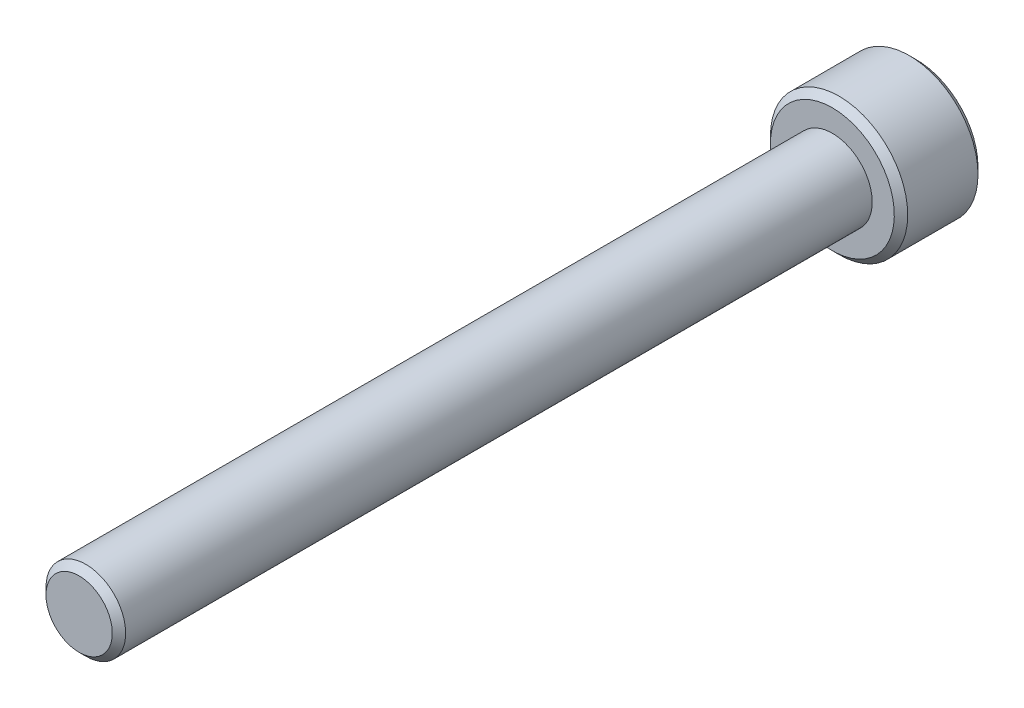
ISO-10303-21;
HEADER;
FILE_DESCRIPTION(('STEP AP214'),'2;1');
FILE_NAME('part.step','',(''),(''),'','','');
FILE_SCHEMA(('AUTOMOTIVE_DESIGN { 1 0 10303 214 1 1 1 1 }'));
ENDSEC;
DATA;
#1=APPLICATION_CONTEXT('core data for automotive mechanical design processes');
#2=APPLICATION_PROTOCOL_DEFINITION('international standard','automotive_design',2000,#1);
#3=PRODUCT_CONTEXT('',#1,'mechanical');
#4=PRODUCT('Part','Part','',(#3));
#5=PRODUCT_RELATED_PRODUCT_CATEGORY('part','',(#4));
#6=PRODUCT_DEFINITION_FORMATION('','',#4);
#7=PRODUCT_DEFINITION_CONTEXT('part definition',#1,'design');
#8=PRODUCT_DEFINITION('design','',#6,#7);
#9=PRODUCT_DEFINITION_SHAPE('','',#8);
#10=(LENGTH_UNIT() NAMED_UNIT(*) SI_UNIT(.MILLI.,.METRE.));
#11=(NAMED_UNIT(*) PLANE_ANGLE_UNIT() SI_UNIT($,.RADIAN.));
#12=(NAMED_UNIT(*) SI_UNIT($,.STERADIAN.) SOLID_ANGLE_UNIT());
#13=UNCERTAINTY_MEASURE_WITH_UNIT(LENGTH_MEASURE(1.E-05),#10,'distance_accuracy_value','');
#14=(GEOMETRIC_REPRESENTATION_CONTEXT(3) GLOBAL_UNCERTAINTY_ASSIGNED_CONTEXT((#13)) GLOBAL_UNIT_ASSIGNED_CONTEXT((#10,
#11,#12)) REPRESENTATION_CONTEXT('',''));
#15=CARTESIAN_POINT('',(0.,0.,0.));
#16=DIRECTION('',(0.,0.,1.));
#17=DIRECTION('',(1.,0.,0.));
#18=AXIS2_PLACEMENT_3D('',#15,#16,#17);
#19=CARTESIAN_POINT('',(-0.674576054522258,1.16839999999997,-29.2099999999992));
#20=DIRECTION('',(0.,1.,0.));
#21=DIRECTION('',(-1.,0.,0.));
#22=AXIS2_PLACEMENT_3D('',#19,#20,#21);
#23=PLANE('',#22);
#24=DIRECTION('',(0.,0.,1.));
#25=VECTOR('',#24,1.);
#26=CARTESIAN_POINT('',(0.674576054521041,1.16840000000002,-29.2100000000007));
#27=LINE('',#26,#25);
#28=CARTESIAN_POINT('',(0.674576054520974,1.16839999999998,-31.7500000000003));
#29=VERTEX_POINT('',#28);
#30=CARTESIAN_POINT('',(0.674576054521038,1.1684,-29.2099999999996));
#31=VERTEX_POINT('',#30);
#32=EDGE_CURVE('E82',#29,#31,#27,.T.);
#33=ORIENTED_EDGE('',*,*,#32,.T.);
#34=DIRECTION('',(-1.,0.,0.));
#35=VECTOR('',#34,1.);
#36=CARTESIAN_POINT('',(-0.674576054522258,1.16839999999997,-29.2099999999992));
#37=LINE('',#36,#35);
#38=CARTESIAN_POINT('',(-0.674576054522049,1.1684,-29.2099999999992));
#39=VERTEX_POINT('',#38);
#40=EDGE_CURVE('E71',#39,#31,#37,.F.);
#41=ORIENTED_EDGE('',*,*,#40,.F.);
#42=DIRECTION('',(0.,0.,1.));
#43=VECTOR('',#42,1.);
#44=CARTESIAN_POINT('',(-0.674576054522344,1.16840000000002,-29.2099999999992));
#45=LINE('',#44,#43);
#46=CARTESIAN_POINT('',(-0.674576054521946,1.16839999999998,-31.7500000000003));
#47=VERTEX_POINT('',#46);
#48=EDGE_CURVE('E90',#39,#47,#45,.F.);
#49=ORIENTED_EDGE('',*,*,#48,.T.);
#50=DIRECTION('',(-1.,0.,0.));
#51=VECTOR('',#50,1.);
#52=CARTESIAN_POINT('',(-0.674576054522258,1.16839999999997,-31.7500000000007));
#53=LINE('',#52,#51);
#54=EDGE_CURVE('E66',#29,#47,#53,.T.);
#55=ORIENTED_EDGE('',*,*,#54,.F.);
#56=EDGE_LOOP('',(#33,#41,#49,#55));
#57=FACE_BOUND('',#56,.T.);
#58=ADVANCED_FACE('F16',(#57),#23,.F.);
#59=CARTESIAN_POINT('',(0.674576054521037,1.16840000000003,-29.2100000000007));
#60=DIRECTION('',(0.866025403784436,0.500000000000005,0.));
#61=DIRECTION('',(-0.500000000000005,0.866025403784436,0.));
#62=AXIS2_PLACEMENT_3D('',#59,#60,#61);
#63=PLANE('',#62);
#64=DIRECTION('',(0.,0.,1.));
#65=VECTOR('',#64,1.);
#66=CARTESIAN_POINT('',(1.34915210904188,0.,-29.2099999999992));
#67=LINE('',#66,#65);
#68=CARTESIAN_POINT('',(1.34915210904193,0.,-31.7499999999996));
#69=VERTEX_POINT('',#68);
#70=CARTESIAN_POINT('',(1.34915210904201,0.,-29.21));
#71=VERTEX_POINT('',#70);
#72=EDGE_CURVE('E86',#69,#71,#67,.T.);
#73=ORIENTED_EDGE('',*,*,#72,.T.);
#74=DIRECTION('',(-0.500000000000005,0.866025403784436,0.));
#75=VECTOR('',#74,1.);
#76=CARTESIAN_POINT('',(0.674576054521037,1.16840000000003,-29.2100000000007));
#77=LINE('',#76,#75);
#78=EDGE_CURVE('E75',#31,#71,#77,.F.);
#79=ORIENTED_EDGE('',*,*,#78,.F.);
#80=ORIENTED_EDGE('',*,*,#32,.F.);
#81=DIRECTION('',(-0.500000000000005,0.866025403784436,0.));
#82=VECTOR('',#81,1.);
#83=CARTESIAN_POINT('',(0.674576054521037,1.16840000000003,-31.7499999999992));
#84=LINE('',#83,#82);
#85=EDGE_CURVE('E88',#69,#29,#84,.T.);
#86=ORIENTED_EDGE('',*,*,#85,.F.);
#87=EDGE_LOOP('',(#73,#79,#80,#86));
#88=FACE_BOUND('',#87,.T.);
#89=ADVANCED_FACE('F85',(#88),#63,.F.);
#90=CARTESIAN_POINT('',(-1.34915210904363,-2.08166817117217E-13,-29.2099999999992));
#91=DIRECTION('',(-0.866025403784441,0.499999999999995,0.));
#92=DIRECTION('',(-0.499999999999995,-0.866025403784441,0.));
#93=AXIS2_PLACEMENT_3D('',#90,#91,#92);
#94=PLANE('',#93);
#95=ORIENTED_EDGE('',*,*,#48,.F.);
#96=DIRECTION('',(-0.500000000000059,-0.866025403784404,0.));
#97=VECTOR('',#96,1.);
#98=CARTESIAN_POINT('',(-0.674576054522258,1.16839999999997,-29.2099999999992));
#99=LINE('',#98,#97);
#100=CARTESIAN_POINT('',(-1.34915210904357,-1.3521187083714E-13,-29.2099999999992));
#101=VERTEX_POINT('',#100);
#102=EDGE_CURVE('E78',#39,#101,#99,.T.);
#103=ORIENTED_EDGE('',*,*,#102,.T.);
#104=DIRECTION('',(0.,0.,1.));
#105=VECTOR('',#104,1.);
#106=CARTESIAN_POINT('',(-1.34915210904355,-1.65015570652294E-13,-29.2099999999992));
#107=LINE('',#106,#105);
#108=CARTESIAN_POINT('',(-1.34915210904345,0.,-31.7499999999996));
#109=VERTEX_POINT('',#108);
#110=EDGE_CURVE('E124',#101,#109,#107,.F.);
#111=ORIENTED_EDGE('',*,*,#110,.T.);
#112=DIRECTION('',(-0.499999999999995,-0.866025403784441,0.));
#113=VECTOR('',#112,1.);
#114=CARTESIAN_POINT('',(-1.34915210904363,-2.08166817117163E-13,-31.7499999999991));
#115=LINE('',#114,#113);
#116=EDGE_CURVE('E134',#47,#109,#115,.T.);
#117=ORIENTED_EDGE('',*,*,#116,.F.);
#118=EDGE_LOOP('',(#95,#103,#111,#117));
#119=FACE_BOUND('',#118,.T.);
#120=ADVANCED_FACE('F137',(#119),#94,.F.);
#121=CARTESIAN_POINT('',(1.34915210904185,0.,-29.2099999999992));
#122=DIRECTION('',(0.866025403784441,-0.499999999999996,0.));
#123=DIRECTION('',(0.499999999999996,0.866025403784441,0.));
#124=AXIS2_PLACEMENT_3D('',#121,#122,#123);
#125=PLANE('',#124);
#126=DIRECTION('',(0.,0.,1.));
#127=VECTOR('',#126,1.);
#128=CARTESIAN_POINT('',(0.674576054520259,-1.16840000000031,-29.2099999999992));
#129=LINE('',#128,#127);
#130=CARTESIAN_POINT('',(0.674576054520401,-1.1684000000004,-31.7499999999996));
#131=VERTEX_POINT('',#130);
#132=CARTESIAN_POINT('',(0.674576054520473,-1.1684000000003,-29.2099999999992));
#133=VERTEX_POINT('',#132);
#134=EDGE_CURVE('E120',#131,#133,#129,.T.);
#135=ORIENTED_EDGE('',*,*,#134,.T.);
#136=DIRECTION('',(0.500000000000042,0.866025403784415,0.));
#137=VECTOR('',#136,1.);
#138=CARTESIAN_POINT('',(0.674576054520482,-1.16840000000031,-29.2099999999992));
#139=LINE('',#138,#137);
#140=EDGE_CURVE('E129',#133,#71,#139,.T.);
#141=ORIENTED_EDGE('',*,*,#140,.T.);
#142=ORIENTED_EDGE('',*,*,#72,.F.);
#143=DIRECTION('',(0.499999999999996,0.866025403784441,0.));
#144=VECTOR('',#143,1.);
#145=CARTESIAN_POINT('',(1.34915210904185,0.,-31.7499999999992));
#146=LINE('',#145,#144);
#147=EDGE_CURVE('E34',#131,#69,#146,.T.);
#148=ORIENTED_EDGE('',*,*,#147,.F.);
#149=EDGE_LOOP('',(#135,#141,#142,#148));
#150=FACE_BOUND('',#149,.T.);
#151=ADVANCED_FACE('F143',(#150),#125,.F.);
#152=CARTESIAN_POINT('',(1.34915210904185,0.,-29.2099999999992));
#153=DIRECTION('',(0.,0.,1.));
#154=DIRECTION('',(0.,-1.,0.));
#155=AXIS2_PLACEMENT_3D('',#152,#153,#154);
#156=PLANE('',#155);
#157=DIRECTION('',(1.,0.,0.));
#158=VECTOR('',#157,1.);
#159=CARTESIAN_POINT('',(0.674576054520482,-1.16840000000031,-29.2099999999992));
#160=LINE('',#159,#158);
#161=CARTESIAN_POINT('',(-0.674576054522355,-1.16840000000025,-29.2099999999992));
#162=VERTEX_POINT('',#161);
#163=EDGE_CURVE('E118',#133,#162,#160,.F.);
#164=ORIENTED_EDGE('',*,*,#163,.T.);
#165=DIRECTION('',(0.500000000000005,-0.866025403784436,0.));
#166=VECTOR('',#165,1.);
#167=CARTESIAN_POINT('',(-0.674576054522369,-1.16840000000019,-29.2099999999992));
#168=LINE('',#167,#166);
#169=EDGE_CURVE('E127',#162,#101,#168,.F.);
#170=ORIENTED_EDGE('',*,*,#169,.T.);
#171=ORIENTED_EDGE('',*,*,#102,.F.);
#172=ORIENTED_EDGE('',*,*,#40,.T.);
#173=ORIENTED_EDGE('',*,*,#78,.T.);
#174=ORIENTED_EDGE('',*,*,#140,.F.);
#175=EDGE_LOOP('',(#164,#170,#171,#172,#173,#174));
#176=FACE_BOUND('',#175,.T.);
#177=ADVANCED_FACE('F72',(#176),#156,.F.);
#178=CARTESIAN_POINT('',(-0.674576054522369,-1.16840000000019,-29.2099999999992));
#179=DIRECTION('',(-0.866025403784436,-0.500000000000005,0.));
#180=DIRECTION('',(0.500000000000005,-0.866025403784436,0.));
#181=AXIS2_PLACEMENT_3D('',#178,#179,#180);
#182=PLANE('',#181);
#183=ORIENTED_EDGE('',*,*,#110,.F.);
#184=ORIENTED_EDGE('',*,*,#169,.F.);
#185=DIRECTION('',(0.,0.,1.));
#186=VECTOR('',#185,1.);
#187=CARTESIAN_POINT('',(-0.674576054522369,-1.16840000000031,-29.2099999999992));
#188=LINE('',#187,#186);
#189=CARTESIAN_POINT('',(-0.674576054522115,-1.16840000000038,-31.7499999999996));
#190=VERTEX_POINT('',#189);
#191=EDGE_CURVE('E115',#162,#190,#188,.F.);
#192=ORIENTED_EDGE('',*,*,#191,.T.);
#193=DIRECTION('',(0.500000000000005,-0.866025403784436,0.));
#194=VECTOR('',#193,1.);
#195=CARTESIAN_POINT('',(-0.674576054522369,-1.16840000000019,-31.7499999999992));
#196=LINE('',#195,#194);
#197=EDGE_CURVE('E122',#109,#190,#196,.T.);
#198=ORIENTED_EDGE('',*,*,#197,.F.);
#199=EDGE_LOOP('',(#183,#184,#192,#198));
#200=FACE_BOUND('',#199,.T.);
#201=ADVANCED_FACE('F150',(#200),#182,.F.);
#202=CARTESIAN_POINT('',(0.674576054520482,-1.16840000000031,-29.2099999999992));
#203=DIRECTION('',(0.,-1.,0.));
#204=DIRECTION('',(1.,0.,0.));
#205=AXIS2_PLACEMENT_3D('',#202,#203,#204);
#206=PLANE('',#205);
#207=ORIENTED_EDGE('',*,*,#191,.F.);
#208=ORIENTED_EDGE('',*,*,#163,.F.);
#209=ORIENTED_EDGE('',*,*,#134,.F.);
#210=DIRECTION('',(1.,0.,0.));
#211=VECTOR('',#210,1.);
#212=CARTESIAN_POINT('',(-7.77156117237609E-13,-1.16840000000061,-31.7500000000008));
#213=LINE('',#212,#211);
#214=EDGE_CURVE('E112',#131,#190,#213,.F.);
#215=ORIENTED_EDGE('',*,*,#214,.T.);
#216=EDGE_LOOP('',(#207,#208,#209,#215));
#217=FACE_BOUND('',#216,.T.);
#218=ADVANCED_FACE('F148',(#217),#206,.F.);
#219=CARTESIAN_POINT('',(-7.77156117237609E-13,2.60349999999997,-31.7500000000008));
#220=DIRECTION('',(0.,0.,1.));
#221=DIRECTION('',(0.,-1.,0.));
#222=AXIS2_PLACEMENT_3D('',#219,#220,#221);
#223=PLANE('',#222);
#224=CARTESIAN_POINT('',(-1.11022302462516E-13,0.,-31.750000000045));
#225=DIRECTION('',(0.,0.,1.));
#226=DIRECTION('',(1.,0.,0.));
#227=AXIS2_PLACEMENT_3D('',#224,#225,#226);
#228=CIRCLE('',#227,2.34950000003675);
#229=CARTESIAN_POINT('',(2.34950000003664,0.,-31.750000000045));
#230=VERTEX_POINT('',#229);
#231=EDGE_CURVE('E19',#230,#230,#228,.T.);
#232=ORIENTED_EDGE('',*,*,#231,.F.);
#233=EDGE_LOOP('',(#232));
#234=FACE_BOUND('',#233,.T.);
#235=ORIENTED_EDGE('',*,*,#147,.T.);
#236=ORIENTED_EDGE('',*,*,#85,.T.);
#237=ORIENTED_EDGE('',*,*,#54,.T.);
#238=ORIENTED_EDGE('',*,*,#116,.T.);
#239=ORIENTED_EDGE('',*,*,#197,.T.);
#240=ORIENTED_EDGE('',*,*,#214,.F.);
#241=EDGE_LOOP('',(#235,#236,#237,#238,#239,#240));
#242=FACE_BOUND('',#241,.T.);
#243=ADVANCED_FACE('F141',(#234,#242),#223,.F.);
#244=CARTESIAN_POINT('',(-1.11022302462516E-13,0.,-31.496000000061));
#245=DIRECTION('',(0.,0.,1.));
#246=DIRECTION('',(1.,0.,0.));
#247=AXIS2_PLACEMENT_3D('',#244,#245,#246);
#248=CONICAL_SURFACE('',#247,2.60350000002074,0.785398163397448);
#249=ORIENTED_EDGE('',*,*,#231,.T.);
#250=EDGE_LOOP('',(#249));
#251=FACE_BOUND('',#250,.T.);
#252=CARTESIAN_POINT('',(0.,0.,-31.4959999999992));
#253=DIRECTION('',(0.,0.,1.));
#254=DIRECTION('',(0.,-1.,0.));
#255=AXIS2_PLACEMENT_3D('',#252,#253,#254);
#256=CIRCLE('',#255,2.60350000000004);
#257=CARTESIAN_POINT('',(0.,-2.60350000000003,-31.4959999999992));
#258=VERTEX_POINT('',#257);
#259=EDGE_CURVE('E105',#258,#258,#256,.T.);
#260=ORIENTED_EDGE('',*,*,#259,.F.);
#261=EDGE_LOOP('',(#260));
#262=FACE_BOUND('',#261,.T.);
#263=ADVANCED_FACE('F186',(#251,#262),#248,.T.);
#264=CARTESIAN_POINT('',(0.,0.,0.));
#265=DIRECTION('',(0.,0.,1.));
#266=DIRECTION('',(0.,-1.,0.));
#267=AXIS2_PLACEMENT_3D('',#264,#265,#266);
#268=CYLINDRICAL_SURFACE('',#267,2.60350000000004);
#269=ORIENTED_EDGE('',*,*,#259,.T.);
#270=EDGE_LOOP('',(#269));
#271=FACE_BOUND('',#270,.T.);
#272=CARTESIAN_POINT('',(-5.55111512312609E-13,-3.46944695195436E-13,-28.8290000000302));
#273=DIRECTION('',(0.,0.,-1.));
#274=DIRECTION('',(-1.,0.,0.));
#275=AXIS2_PLACEMENT_3D('',#272,#273,#274);
#276=CIRCLE('',#275,2.60349999996323);
#277=CARTESIAN_POINT('',(-2.60349999996379,-3.46944695195436E-13,-28.8290000000302));
#278=VERTEX_POINT('',#277);
#279=EDGE_CURVE('E101',#278,#278,#276,.F.);
#280=ORIENTED_EDGE('',*,*,#279,.F.);
#281=EDGE_LOOP('',(#280));
#282=FACE_BOUND('',#281,.T.);
#283=ADVANCED_FACE('F183',(#271,#282),#268,.T.);
#284=CARTESIAN_POINT('',(-5.55111512312578E-13,-3.46944695195436E-13,-28.8289999999165));
#285=DIRECTION('',(0.,0.,-1.));
#286=DIRECTION('',(0.,1.,0.));
#287=AXIS2_PLACEMENT_3D('',#284,#285,#286);
#288=CONICAL_SURFACE('',#287,2.60349999990639,0.785398163397448);
#289=CARTESIAN_POINT('',(-5.55111512312578E-13,-3.47113936510123E-13,-28.5749999999894));
#290=DIRECTION('',(0.,0.,-1.));
#291=DIRECTION('',(0.,1.,0.));
#292=AXIS2_PLACEMENT_3D('',#289,#290,#291);
#293=CIRCLE('',#292,2.34949999997924);
#294=CARTESIAN_POINT('',(-5.55111512312578E-13,2.3494999999789,-28.5749999999894));
#295=VERTEX_POINT('',#294);
#296=EDGE_CURVE('E99',#295,#295,#293,.T.);
#297=ORIENTED_EDGE('',*,*,#296,.T.);
#298=EDGE_LOOP('',(#297));
#299=FACE_BOUND('',#298,.T.);
#300=ORIENTED_EDGE('',*,*,#279,.T.);
#301=EDGE_LOOP('',(#300));
#302=FACE_BOUND('',#301,.T.);
#303=ADVANCED_FACE('F179',(#299,#302),#288,.T.);
#304=CARTESIAN_POINT('',(0.,0.,0.));
#305=DIRECTION('',(0.,0.,-1.));
#306=DIRECTION('',(0.,1.,0.));
#307=AXIS2_PLACEMENT_3D('',#304,#305,#306);
#308=PLANE('',#307);
#309=CARTESIAN_POINT('',(0.,0.,0.));
#310=DIRECTION('',(0.,0.,-1.));
#311=DIRECTION('',(-1.,0.,0.));
#312=AXIS2_PLACEMENT_3D('',#309,#310,#311);
#313=CIRCLE('',#312,1.25730000002022);
#314=CARTESIAN_POINT('',(-1.25730000002022,0.,0.));
#315=VERTEX_POINT('',#314);
#316=EDGE_CURVE('E97',#315,#315,#313,.T.);
#317=ORIENTED_EDGE('',*,*,#316,.F.);
#318=EDGE_LOOP('',(#317));
#319=FACE_BOUND('',#318,.T.);
#320=ADVANCED_FACE('F175',(#319),#308,.F.);
#321=CARTESIAN_POINT('',(-7.77156117237609E-13,1.51129999999987,-28.5750000000007));
#322=DIRECTION('',(0.,0.,-1.));
#323=DIRECTION('',(0.,1.,0.));
#324=AXIS2_PLACEMENT_3D('',#321,#322,#323);
#325=PLANE('',#324);
#326=CARTESIAN_POINT('',(0.,0.,-28.5749999999992));
#327=DIRECTION('',(0.,0.,1.));
#328=DIRECTION('',(0.,-1.,0.));
#329=AXIS2_PLACEMENT_3D('',#326,#327,#328);
#330=CIRCLE('',#329,1.51130000000002);
#331=CARTESIAN_POINT('',(0.,-1.51130000000001,-28.5749999999992));
#332=VERTEX_POINT('',#331);
#333=EDGE_CURVE('E25',#332,#332,#330,.T.);
#334=ORIENTED_EDGE('',*,*,#333,.F.);
#335=EDGE_LOOP('',(#334));
#336=FACE_BOUND('',#335,.T.);
#337=ORIENTED_EDGE('',*,*,#296,.F.);
#338=EDGE_LOOP('',(#337));
#339=FACE_BOUND('',#338,.T.);
#340=ADVANCED_FACE('F168',(#336,#339),#325,.F.);
#341=CARTESIAN_POINT('',(0.,0.,-0.253999999927146));
#342=DIRECTION('',(0.,0.,-1.));
#343=DIRECTION('',(-1.,0.,0.));
#344=AXIS2_PLACEMENT_3D('',#341,#342,#343);
#345=CONICAL_SURFACE('',#344,1.51129999994737,0.785398163397448);
#346=CARTESIAN_POINT('',(0.,0.,-0.25399999999997));
#347=DIRECTION('',(0.,0.,1.));
#348=DIRECTION('',(0.,-1.,0.));
#349=AXIS2_PLACEMENT_3D('',#346,#347,#348);
#350=CIRCLE('',#349,1.51130000000002);
#351=CARTESIAN_POINT('',(0.,-1.51130000000001,-0.25399999999997));
#352=VERTEX_POINT('',#351);
#353=EDGE_CURVE('E11',#352,#352,#350,.F.);
#354=ORIENTED_EDGE('',*,*,#353,.F.);
#355=EDGE_LOOP('',(#354));
#356=FACE_BOUND('',#355,.T.);
#357=ORIENTED_EDGE('',*,*,#316,.T.);
#358=EDGE_LOOP('',(#357));
#359=FACE_BOUND('',#358,.T.);
#360=ADVANCED_FACE('F162',(#356,#359),#345,.T.);
#361=CARTESIAN_POINT('',(0.,0.,0.));
#362=DIRECTION('',(0.,0.,1.));
#363=DIRECTION('',(0.,-1.,0.));
#364=AXIS2_PLACEMENT_3D('',#361,#362,#363);
#365=CYLINDRICAL_SURFACE('',#364,1.51130000000002);
#366=ORIENTED_EDGE('',*,*,#353,.T.);
#367=EDGE_LOOP('',(#366));
#368=FACE_BOUND('',#367,.T.);
#369=ORIENTED_EDGE('',*,*,#333,.T.);
#370=EDGE_LOOP('',(#369));
#371=FACE_BOUND('',#370,.T.);
#372=ADVANCED_FACE('F160',(#368,#371),#365,.T.);
#373=CLOSED_SHELL('',(#58,#89,#120,#151,#177,#201,#218,#243,#263,#283,#303,#320,#340,#360,#372));
#374=MANIFOLD_SOLID_BREP('B1',#373);
#375=ADVANCED_BREP_SHAPE_REPRESENTATION('',(#18,#374),#14);
#376=SHAPE_DEFINITION_REPRESENTATION(#9,#375);
ENDSEC;
END-ISO-10303-21;
